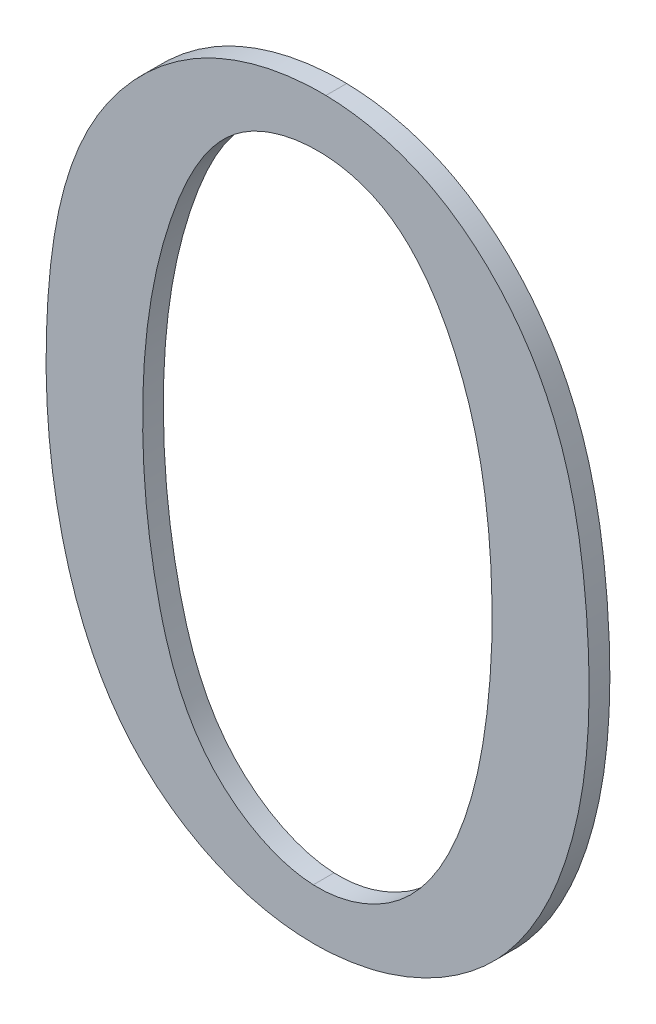
ISO-10303-21;
HEADER;
FILE_DESCRIPTION(('STEP AP214'),'2;1');
FILE_NAME('part.step','',(''),(''),'','','');
FILE_SCHEMA(('AUTOMOTIVE_DESIGN { 1 0 10303 214 1 1 1 1 }'));
ENDSEC;
DATA;
#1=APPLICATION_CONTEXT('core data for automotive mechanical design processes');
#2=APPLICATION_PROTOCOL_DEFINITION('international standard','automotive_design',2000,#1);
#3=PRODUCT_CONTEXT('',#1,'mechanical');
#4=PRODUCT('Part','Part','',(#3));
#5=PRODUCT_RELATED_PRODUCT_CATEGORY('part','',(#4));
#6=PRODUCT_DEFINITION_FORMATION('','',#4);
#7=PRODUCT_DEFINITION_CONTEXT('part definition',#1,'design');
#8=PRODUCT_DEFINITION('design','',#6,#7);
#9=PRODUCT_DEFINITION_SHAPE('','',#8);
#10=(LENGTH_UNIT() NAMED_UNIT(*) SI_UNIT(.MILLI.,.METRE.));
#11=(NAMED_UNIT(*) PLANE_ANGLE_UNIT() SI_UNIT($,.RADIAN.));
#12=(NAMED_UNIT(*) SI_UNIT($,.STERADIAN.) SOLID_ANGLE_UNIT());
#13=UNCERTAINTY_MEASURE_WITH_UNIT(LENGTH_MEASURE(1.E-05),#10,'distance_accuracy_value','');
#14=(GEOMETRIC_REPRESENTATION_CONTEXT(3) GLOBAL_UNCERTAINTY_ASSIGNED_CONTEXT((#13)) GLOBAL_UNIT_ASSIGNED_CONTEXT((#10,
#11,#12)) REPRESENTATION_CONTEXT('',''));
#15=CARTESIAN_POINT('',(0.,0.,0.));
#16=DIRECTION('',(0.,0.,1.));
#17=DIRECTION('',(1.,0.,0.));
#18=AXIS2_PLACEMENT_3D('',#15,#16,#17);
#19=CARTESIAN_POINT('',(0.,0.,0.05));
#20=DIRECTION('',(0.,0.,1.));
#21=DIRECTION('',(1.,0.,0.));
#22=AXIS2_PLACEMENT_3D('',#19,#20,#21);
#23=PLANE('',#22);
#24=CARTESIAN_POINT('',(-0.993622049562989,-2.83354620100467,0.05));
#25=CARTESIAN_POINT('',(-1.01621349821605,-2.83283314246044,0.05));
#26=CARTESIAN_POINT('',(-1.03891668393038,-2.83424035118711,0.05));
#27=CARTESIAN_POINT('',(-1.08373108073225,-2.84142533305858,0.05));
#28=CARTESIAN_POINT('',(-1.10583868348876,-2.84722535287117,0.05));
#29=CARTESIAN_POINT('',(-1.14543425474012,-2.8622141019412,0.05));
#30=CARTESIAN_POINT('',(-1.16313685193765,-2.87081856421989,0.05));
#31=CARTESIAN_POINT('',(-1.18799205663139,-2.8863198148663,0.05));
#32=CARTESIAN_POINT('',(-1.19597663243572,-2.89190261826089,0.05));
#33=CARTESIAN_POINT('',(-1.21133578068215,-2.90385466635892,0.05));
#34=CARTESIAN_POINT('',(-1.21871012842404,-2.91022419862132,0.05));
#35=CARTESIAN_POINT('',(-1.24149665690474,-2.93182671242595,0.05));
#36=CARTESIAN_POINT('',(-1.25568643253836,-2.94835737870916,0.05));
#37=CARTESIAN_POINT('',(-1.28138904175354,-2.98347429244935,0.05));
#38=CARTESIAN_POINT('',(-1.29288193188875,-3.00207444140932,0.05));
#39=CARTESIAN_POINT('',(-1.31432411942431,-3.04155236970739,0.05));
#40=CARTESIAN_POINT('',(-1.3241419752747,-3.06249979218505,0.05));
#41=CARTESIAN_POINT('',(-1.34206775927301,-3.10512702677778,0.05));
#42=CARTESIAN_POINT('',(-1.3501730385335,-3.12680791414391,0.05));
#43=CARTESIAN_POINT('',(-1.36514997514574,-3.1706017616821,0.05));
#44=CARTESIAN_POINT('',(-1.3720209633782,-3.19271494904868,0.05));
#45=CARTESIAN_POINT('',(-1.38447037947149,-3.23727939687559,0.05));
#46=CARTESIAN_POINT('',(-1.39004998969979,-3.25973032787985,0.05));
#47=CARTESIAN_POINT('',(-1.40399590066922,-3.32324864114575,0.05));
#48=CARTESIAN_POINT('',(-1.41094688332614,-3.36463188978735,0.05));
#49=CARTESIAN_POINT('',(-1.42114773707585,-3.44789191204677,0.05));
#50=CARTESIAN_POINT('',(-1.42439238818732,-3.48976929800393,0.05));
#51=CARTESIAN_POINT('',(-1.42687951665125,-3.55264519832025,0.05));
#52=CARTESIAN_POINT('',(-1.42731218911848,-3.57360627258616,0.05));
#53=CARTESIAN_POINT('',(-1.42747385179158,-3.61553134591197,0.05));
#54=CARTESIAN_POINT('',(-1.42720281158748,-3.63649534505911,0.05));
#55=CARTESIAN_POINT('',(-1.42531254100426,-3.69932091085984,0.05));
#56=CARTESIAN_POINT('',(-1.42261784871447,-3.74115996255967,0.05));
#57=CARTESIAN_POINT('',(-1.41620694186505,-3.80351403640446,0.05));
#58=CARTESIAN_POINT('',(-1.41368832211816,-3.82415832205073,0.05));
#59=CARTESIAN_POINT('',(-1.40783680155164,-3.86533511221441,0.05));
#60=CARTESIAN_POINT('',(-1.4045038040934,-3.88586760316981,0.05));
#61=CARTESIAN_POINT('',(-1.39700800695053,-3.92680134546588,0.05));
#62=CARTESIAN_POINT('',(-1.39284440980923,-3.94720245108119,0.05));
#63=CARTESIAN_POINT('',(-1.38362429811457,-3.98779915382978,0.05));
#64=CARTESIAN_POINT('',(-1.37856794818727,-4.0079947881276,0.05));
#65=CARTESIAN_POINT('',(-1.36443191021927,-4.05744698805098,0.05));
#66=CARTESIAN_POINT('',(-1.35457855766577,-4.08649613618047,0.05));
#67=CARTESIAN_POINT('',(-1.33069083702329,-4.14274826068706,0.05));
#68=CARTESIAN_POINT('',(-1.31667921879037,-4.16996031820831,0.05));
#69=CARTESIAN_POINT('',(-1.28745581030387,-4.21483707444749,0.05));
#70=CARTESIAN_POINT('',(-1.27335921116791,-4.23321668703175,0.05));
#71=CARTESIAN_POINT('',(-1.24215967661568,-4.26734011271521,0.05));
#72=CARTESIAN_POINT('',(-1.2250470003049,-4.28307505260181,0.05));
#73=CARTESIAN_POINT('',(-1.18836031984282,-4.31152586204723,0.05));
#74=CARTESIAN_POINT('',(-1.16877601753389,-4.32422841659115,0.05));
#75=CARTESIAN_POINT('',(-1.127644715583,-4.34578023458505,0.05));
#76=CARTESIAN_POINT('',(-1.10610761304161,-4.35464774441303,0.05));
#77=CARTESIAN_POINT('',(-1.07279578589066,-4.36431214701863,0.05));
#78=CARTESIAN_POINT('',(-1.06153793853756,-4.36692652742064,0.05));
#79=CARTESIAN_POINT('',(-1.03876600956441,-4.37081105458462,0.05));
#80=CARTESIAN_POINT('',(-1.02725135515949,-4.37207780702638,0.05));
#81=CARTESIAN_POINT('',(-1.01568012379935,-4.37259357253366,0.05));
#82=B_SPLINE_CURVE_WITH_KNOTS('',3,(#24,#25,#26,#27,#28,#29,#30,#31,#32,#33,#34,#35,#36,#37,#38,
#39,#40,#41,#42,#43,#44,#45,#46,#47,#48,#49,#50,#51,#52,#53,#54,#55,#56,#57,#58,#59,#60,#61,#62,
#63,#64,#65,#66,#67,#68,#69,#70,#71,#72,#73,#74,#75,#76,#77,#78,#79,#80,#81),.UNSPECIFIED.,.F.,
.F.,(4,2,2,2,2,2,2,2,2,2,2,2,2,2,2,2,2,2,2,2,2,2,2,2,2,2,2,2,4),(0.,0.0677799652700998,
0.135905505527599,0.194545605237095,0.223724035601037,0.252913162772909,0.3178665943049,
0.383286199488275,0.452573742867857,0.521967683055773,0.591399129483015,0.660766751731908,
0.786452350423463,0.912314746757769,0.975200846877584,1.03808966458041,1.16373569822066,
1.22611488887498,1.28850148539192,1.3509482699193,1.41338355109159,1.50519383502833,
1.59651080513591,1.66568136946222,1.73507956741071,1.80477710318597,1.87413928293902,
1.90873930894442,1.94342627846349),.UNSPECIFIED.);
#83=CARTESIAN_POINT('',(-0.993622049562989,-2.83354620100466,0.05));
#84=VERTEX_POINT('',#83);
#85=CARTESIAN_POINT('',(-1.0156801237992,-4.37259357253339,0.05));
#86=VERTEX_POINT('',#85);
#87=EDGE_CURVE('E105',#84,#86,#82,.T.);
#88=ORIENTED_EDGE('',*,*,#87,.F.);
#89=CARTESIAN_POINT('',(-1.01568012379919,-4.37259357253312,0.05));
#90=CARTESIAN_POINT('',(-0.998977398715831,-4.37334668369637,0.05));
#91=CARTESIAN_POINT('',(-0.982262975398597,-4.37247907838417,0.05));
#92=CARTESIAN_POINT('',(-0.949268128925352,-4.36787422922595,0.05));
#93=CARTESIAN_POINT('',(-0.932986719265759,-4.36414421388707,0.05));
#94=CARTESIAN_POINT('',(-0.901299307044916,-4.35420909322109,0.05));
#95=CARTESIAN_POINT('',(-0.885889657703982,-4.34801532933845,0.05));
#96=CARTESIAN_POINT('',(-0.85614558106627,-4.33343231473239,0.05));
#97=CARTESIAN_POINT('',(-0.841811236667662,-4.32504289496325,0.05));
#98=CARTESIAN_POINT('',(-0.812920732830148,-4.30508197253257,0.05));
#99=CARTESIAN_POINT('',(-0.798544452524687,-4.29324939766546,0.05));
#100=CARTESIAN_POINT('',(-0.771759581617321,-4.26754861438779,0.05));
#101=CARTESIAN_POINT('',(-0.75935294300782,-4.25367841248971,0.05));
#102=CARTESIAN_POINT('',(-0.728840439875247,-4.21489995242396,0.05));
#103=CARTESIAN_POINT('',(-0.712347298580316,-4.188727971387,0.05));
#104=CARTESIAN_POINT('',(-0.690651027950262,-4.14792155114691,0.05));
#105=CARTESIAN_POINT('',(-0.683916613827432,-4.1340343668766,0.05));
#106=CARTESIAN_POINT('',(-0.671308750489108,-4.10587248728212,0.05));
#107=CARTESIAN_POINT('',(-0.665435157692496,-4.09159785705401,0.05));
#108=CARTESIAN_POINT('',(-0.649518753330763,-4.04980692169234,0.05));
#109=CARTESIAN_POINT('',(-0.640468638156906,-4.02191103417305,0.05));
#110=CARTESIAN_POINT('',(-0.624834565518525,-3.96542948029411,0.05));
#111=CARTESIAN_POINT('',(-0.618252626773926,-3.9368432695693,0.05));
#112=CARTESIAN_POINT('',(-0.607078494523846,-3.87914200562613,0.05));
#113=CARTESIAN_POINT('',(-0.602496858640348,-3.85002497169625,0.05));
#114=CARTESIAN_POINT('',(-0.59486700382088,-3.79160505468036,0.05));
#115=CARTESIAN_POINT('',(-0.59181841922562,-3.76230221760171,0.05));
#116=CARTESIAN_POINT('',(-0.585836604874688,-3.68592857066684,0.05));
#117=CARTESIAN_POINT('',(-0.584073217141164,-3.63876047733424,0.05));
#118=CARTESIAN_POINT('',(-0.58428770201693,-3.54438827803026,0.05));
#119=CARTESIAN_POINT('',(-0.586270136703927,-3.4971841982254,0.05));
#120=CARTESIAN_POINT('',(-0.59388778926284,-3.40348174463469,0.05));
#121=CARTESIAN_POINT('',(-0.599489722447314,-3.3569808529613,0.05));
#122=CARTESIAN_POINT('',(-0.616133482709873,-3.26495754389704,0.05));
#123=CARTESIAN_POINT('',(-0.627163741750178,-3.21943325966363,0.05));
#124=CARTESIAN_POINT('',(-0.649547671204908,-3.15069532536715,0.05));
#125=CARTESIAN_POINT('',(-0.658504112619677,-3.12669352601481,0.05));
#126=CARTESIAN_POINT('',(-0.678515219736413,-3.07958661909986,0.05));
#127=CARTESIAN_POINT('',(-0.689568500596591,-3.05648093176968,0.05));
#128=CARTESIAN_POINT('',(-0.714393170727437,-3.0113630450389,0.05));
#129=CARTESIAN_POINT('',(-0.728196964726775,-2.98936823101312,0.05));
#130=CARTESIAN_POINT('',(-0.759201943643932,-2.9479632965516,0.05));
#131=CARTESIAN_POINT('',(-0.776384735196493,-2.92854009544258,0.05));
#132=CARTESIAN_POINT('',(-0.808156404630453,-2.89993605960512,0.05));
#133=CARTESIAN_POINT('',(-0.821619960055952,-2.88952504010305,0.05));
#134=CARTESIAN_POINT('',(-0.850226756079179,-2.87131532060287,0.05));
#135=CARTESIAN_POINT('',(-0.865369688607754,-2.86351614253369,0.05));
#136=CARTESIAN_POINT('',(-0.8967245716678,-2.85066146791451,0.05));
#137=CARTESIAN_POINT('',(-0.91293468541031,-2.84560138860419,0.05));
#138=CARTESIAN_POINT('',(-0.945934585094399,-2.83804706207882,0.05));
#139=CARTESIAN_POINT('',(-0.962724225746551,-2.83555217652079,0.05));
#140=CARTESIAN_POINT('',(-0.984262466184287,-2.83395406485446,0.05));
#141=CARTESIAN_POINT('',(-0.988941676434133,-2.83370279384799,0.05));
#142=CARTESIAN_POINT('',(-0.993622049562988,-2.83354620100464,0.05));
#143=B_SPLINE_CURVE_WITH_KNOTS('',3,(#89,#90,#91,#92,#93,#94,#95,#96,#97,#98,#99,#100,#101,#102,
#103,#104,#105,#106,#107,#108,#109,#110,#111,#112,#113,#114,#115,#116,#117,#118,#119,#120,#121,
#122,#123,#124,#125,#126,#127,#128,#129,#130,#131,#132,#133,#134,#135,#136,#137,#138,#139,#140,
#141,#142),.UNSPECIFIED.,.F.,.F.,(4,2,2,2,2,2,2,2,2,2,2,2,2,2,2,2,2,2,2,2,2,2,2,2,2,2,4),(0.,
0.0499939568893522,0.0998620767203614,0.149503245638216,0.19914823760373,0.254751899174562,
0.310410326725583,0.402645795864626,0.448934072599764,0.4952146198506,0.583056303584182,
0.670969677078098,0.759341608362729,0.847692451401234,0.989127235021357,1.13073438463424,
1.27105750830802,1.41108288279973,1.48785051490157,1.56456762180822,1.64224857793351,
1.71951783716142,1.77033847261505,1.82114980077632,1.87187585214553,1.92258927738786,
1.93664257474663),.UNSPECIFIED.);
#144=EDGE_CURVE('E146',#86,#84,#143,.T.);
#145=ORIENTED_EDGE('',*,*,#144,.F.);
#146=EDGE_LOOP('',(#88,#145));
#147=FACE_BOUND('',#146,.T.);
#148=CARTESIAN_POINT('',(-1.01550550810966,-4.49508674440558,0.05));
#149=CARTESIAN_POINT('',(-0.99837899342769,-4.49514275357607,0.05));
#150=CARTESIAN_POINT('',(-0.981258548164407,-4.49446141749647,0.05));
#151=CARTESIAN_POINT('',(-0.947142339694509,-4.49163686055452,0.05));
#152=CARTESIAN_POINT('',(-0.930146550437761,-4.48949395446367,0.05));
#153=CARTESIAN_POINT('',(-0.879506356313942,-4.48089206866946,0.05));
#154=CARTESIAN_POINT('',(-0.846206517785656,-4.47225992604298,0.05));
#155=CARTESIAN_POINT('',(-0.781579122097005,-4.44959813424604,0.05));
#156=CARTESIAN_POINT('',(-0.750248948800369,-4.43557582847103,0.05));
#157=CARTESIAN_POINT('',(-0.690289672530589,-4.40268363493706,0.05));
#158=CARTESIAN_POINT('',(-0.661657754710261,-4.38381887714949,0.05));
#159=CARTESIAN_POINT('',(-0.607112908824592,-4.34096776690495,0.05));
#160=CARTESIAN_POINT('',(-0.581303708230917,-4.3168480217517,0.05));
#161=CARTESIAN_POINT('',(-0.534370902660908,-4.26441606313266,0.05));
#162=CARTESIAN_POINT('',(-0.513251583879393,-4.23610005367884,0.05));
#163=CARTESIAN_POINT('',(-0.469206935806305,-4.16680274049215,0.05));
#164=CARTESIAN_POINT('',(-0.448006726707776,-4.12473608682205,0.05));
#165=CARTESIAN_POINT('',(-0.421351862031746,-4.05962342448411,0.05));
#166=CARTESIAN_POINT('',(-0.413318434812916,-4.03755814850853,0.05));
#167=CARTESIAN_POINT('',(-0.398817961023092,-3.99291242831324,0.05));
#168=CARTESIAN_POINT('',(-0.392350953782008,-3.97033197117386,0.05));
#169=CARTESIAN_POINT('',(-0.377893375871974,-3.91284532319142,0.05));
#170=CARTESIAN_POINT('',(-0.370885077879054,-3.87769115737071,0.05));
#171=CARTESIAN_POINT('',(-0.360020840654708,-3.80690251912315,0.05));
#172=CARTESIAN_POINT('',(-0.356166008585009,-3.77126788246565,0.05));
#173=CARTESIAN_POINT('',(-0.351175817981176,-3.69964101479832,0.05));
#174=CARTESIAN_POINT('',(-0.350054132487849,-3.66364788669403,0.05));
#175=CARTESIAN_POINT('',(-0.350117205076619,-3.59166585280207,0.05));
#176=CARTESIAN_POINT('',(-0.35130238290878,-3.55567694897466,0.05));
#177=CARTESIAN_POINT('',(-0.354372093579797,-3.50328628554547,0.05));
#178=CARTESIAN_POINT('',(-0.355529788911434,-3.48683686285715,0.05));
#179=CARTESIAN_POINT('',(-0.358209173065266,-3.45396783936059,0.05));
#180=CARTESIAN_POINT('',(-0.359730856392877,-3.43754823810596,0.05));
#181=CARTESIAN_POINT('',(-0.364967985521243,-3.38835423956911,0.05));
#182=CARTESIAN_POINT('',(-0.369355463452381,-3.35564555968316,0.05));
#183=CARTESIAN_POINT('',(-0.380505436850438,-3.29085679105527,0.05));
#184=CARTESIAN_POINT('',(-0.38725091078145,-3.25877389237495,0.05));
#185=CARTESIAN_POINT('',(-0.403753543962052,-3.19540817863297,0.05));
#186=CARTESIAN_POINT('',(-0.413507607860197,-3.16412457688034,0.05));
#187=CARTESIAN_POINT('',(-0.438766257424035,-3.09728720780177,0.05));
#188=CARTESIAN_POINT('',(-0.454995628598031,-3.06199668409931,0.05));
#189=CARTESIAN_POINT('',(-0.493098708665102,-2.99449389070704,0.05));
#190=CARTESIAN_POINT('',(-0.514982688675055,-2.9622873702985,0.05));
#191=CARTESIAN_POINT('',(-0.563943167077291,-2.90180337965092,0.05));
#192=CARTESIAN_POINT('',(-0.591046869602773,-2.87354789522254,0.05));
#193=CARTESIAN_POINT('',(-0.649990964994206,-2.82249180328482,0.05));
#194=CARTESIAN_POINT('',(-0.681822414425003,-2.79968110386323,0.05));
#195=CARTESIAN_POINT('',(-0.746450439750207,-2.76312881204835,0.05));
#196=CARTESIAN_POINT('',(-0.778879544758867,-2.74873940298932,0.05));
#197=CARTESIAN_POINT('',(-0.845856112605676,-2.72635319097054,0.05));
#198=CARTESIAN_POINT('',(-0.880402224910848,-2.71835235723902,0.05));
#199=CARTESIAN_POINT('',(-0.926920720924731,-2.71191472649269,0.05));
#200=CARTESIAN_POINT('',(-0.938557599864757,-2.71065929079347,0.05));
#201=CARTESIAN_POINT('',(-0.961853178092834,-2.70884191047768,0.05));
#202=CARTESIAN_POINT('',(-0.973511728573983,-2.70827806188659,0.05));
#203=CARTESIAN_POINT('',(-0.9851826863659,-2.708054097028,0.05));
#204=B_SPLINE_CURVE_WITH_KNOTS('',3,(#148,#149,#150,#151,#152,#153,#154,#155,#156,#157,#158,
#159,#160,#161,#162,#163,#164,#165,#166,#167,#168,#169,#170,#171,#172,#173,#174,#175,#176,#177,
#178,#179,#180,#181,#182,#183,#184,#185,#186,#187,#188,#189,#190,#191,#192,#193,#194,#195,#196,
#197,#198,#199,#200,#201,#202,#203),.UNSPECIFIED.,.F.,.F.,(4,2,2,2,2,2,2,2,2,2,2,2,2,2,2,2,2,2,
2,2,2,2,2,2,2,2,2,4),(0.,0.0513473515449543,0.10268364814148,0.205348522397188,
0.307874022023171,0.410291353773996,0.5156974113686,0.621199409193594,0.761700941753019,
0.832108148232498,0.902517122323538,1.00988645744719,1.11729347309886,1.22523671778053,
1.33319960533352,1.38266704203714,1.43213373205176,1.53106984918317,1.62930604732336,
1.72744151157158,1.8434950607409,1.95976091163106,2.07664996982239,2.19332066182609,
2.29910031366481,2.4048131726326,2.43991230291878,2.47491458503729),.UNSPECIFIED.);
#205=CARTESIAN_POINT('',(-1.01550550810966,-4.49508674440565,0.05));
#206=VERTEX_POINT('',#205);
#207=CARTESIAN_POINT('',(-0.985182686365902,-2.7080540970281,0.05));
#208=VERTEX_POINT('',#207);
#209=EDGE_CURVE('E63',#206,#208,#204,.T.);
#210=ORIENTED_EDGE('',*,*,#209,.T.);
#211=CARTESIAN_POINT('',(-0.985182686365904,-2.7080540970282,0.05));
#212=CARTESIAN_POINT('',(-1.0195054785009,-2.7074212204339,0.05));
#213=CARTESIAN_POINT('',(-1.05386170657166,-2.70968719248375,0.05));
#214=CARTESIAN_POINT('',(-1.1216795584063,-2.71985530664894,0.05));
#215=CARTESIAN_POINT('',(-1.15514239861968,-2.72774933180749,0.05));
#216=CARTESIAN_POINT('',(-1.22038496234083,-2.74903358360591,0.05));
#217=CARTESIAN_POINT('',(-1.25216097678,-2.76243539817251,0.05));
#218=CARTESIAN_POINT('',(-1.29764142804317,-2.78657723994159,0.05));
#219=CARTESIAN_POINT('',(-1.31244133135335,-2.79530059300349,0.05));
#220=CARTESIAN_POINT('',(-1.34122610626415,-2.81400373995116,0.05));
#221=CARTESIAN_POINT('',(-1.35521086562436,-2.82398370626996,0.05));
#222=CARTESIAN_POINT('',(-1.39514130968766,-2.85500836853745,0.05));
#223=CARTESIAN_POINT('',(-1.4199017605431,-2.87759710704193,0.05));
#224=CARTESIAN_POINT('',(-1.46589244252199,-2.92611552562047,0.05));
#225=CARTESIAN_POINT('',(-1.48712085866431,-2.95204691128487,0.05));
#226=CARTESIAN_POINT('',(-1.51744676542104,-2.9949118548085,0.05));
#227=CARTESIAN_POINT('',(-1.5278445305897,-3.01093959683713,0.05));
#228=CARTESIAN_POINT('',(-1.54728528109042,-3.04379693501194,0.05));
#229=CARTESIAN_POINT('',(-1.556328271992,-3.06062652786132,0.05));
#230=CARTESIAN_POINT('',(-1.58138816872963,-3.11208626326093,0.05));
#231=CARTESIAN_POINT('',(-1.59536282128603,-3.14772561982821,0.05));
#232=CARTESIAN_POINT('',(-1.61651484255669,-3.214410884685,0.05));
#233=CARTESIAN_POINT('',(-1.62443649775287,-3.24523377694702,0.05));
#234=CARTESIAN_POINT('',(-1.63749656854595,-3.30748487181322,0.05));
#235=CARTESIAN_POINT('',(-1.64263218126262,-3.33891365118045,0.05));
#236=CARTESIAN_POINT('',(-1.65072105589884,-3.40221971002247,0.05));
#237=CARTESIAN_POINT('',(-1.65366132915376,-3.43409853930096,0.05));
#238=CARTESIAN_POINT('',(-1.65800490467578,-3.49794641357791,0.05));
#239=CARTESIAN_POINT('',(-1.65940857612639,-3.5299154350554,0.05));
#240=CARTESIAN_POINT('',(-1.66073009554466,-3.59905991696326,0.05));
#241=CARTESIAN_POINT('',(-1.66037117189994,-3.63624186441361,0.05));
#242=CARTESIAN_POINT('',(-1.65712644673813,-3.71050624506079,0.05));
#243=CARTESIAN_POINT('',(-1.6542404482625,-3.74758867027496,0.05));
#244=CARTESIAN_POINT('',(-1.64570040469219,-3.82126893140597,0.05));
#245=CARTESIAN_POINT('',(-1.64005877510254,-3.85786819165581,0.05));
#246=CARTESIAN_POINT('',(-1.62587651001136,-3.93049386308143,0.05));
#247=CARTESIAN_POINT('',(-1.61733732599094,-3.96652055163677,0.05));
#248=CARTESIAN_POINT('',(-1.59622614212801,-4.03917773933332,0.05));
#249=CARTESIAN_POINT('',(-1.58348895740571,-4.07576164353837,0.05));
#250=CARTESIAN_POINT('',(-1.55316705021058,-4.14688905719526,0.05));
#251=CARTESIAN_POINT('',(-1.53559022445831,-4.18143578011759,0.05));
#252=CARTESIAN_POINT('',(-1.50481087084597,-4.23086542562008,0.05));
#253=CARTESIAN_POINT('',(-1.49370899021734,-4.2470625434523,0.05));
#254=CARTESIAN_POINT('',(-1.46997966235191,-4.27829279554428,0.05));
#255=CARTESIAN_POINT('',(-1.45735271601088,-4.29332630933308,0.05));
#256=CARTESIAN_POINT('',(-1.41719552977907,-4.33631296688514,0.05));
#257=CARTESIAN_POINT('',(-1.38737254026027,-4.36217941486089,0.05));
#258=CARTESIAN_POINT('',(-1.3281423781895,-4.40422796914432,0.05));
#259=CARTESIAN_POINT('',(-1.29933461134968,-4.42127860900421,0.05));
#260=CARTESIAN_POINT('',(-1.23931160606199,-4.45045551078412,0.05));
#261=CARTESIAN_POINT('',(-1.20809760299187,-4.4625842798517,0.05));
#262=CARTESIAN_POINT('',(-1.15006791573668,-4.47953480901039,0.05));
#263=CARTESIAN_POINT('',(-1.1235273791172,-4.48530115921312,0.05));
#264=CARTESIAN_POINT('',(-1.08328148742578,-4.49109705500292,0.05));
#265=CARTESIAN_POINT('',(-1.06976937762697,-4.49255344965934,0.05));
#266=CARTESIAN_POINT('',(-1.04267461533505,-4.49452325173471,0.05));
#267=CARTESIAN_POINT('',(-1.02909195407206,-4.49503653896436,0.05));
#268=CARTESIAN_POINT('',(-1.0155055081105,-4.49508674440572,0.05));
#269=B_SPLINE_CURVE_WITH_KNOTS('',3,(#211,#212,#213,#214,#215,#216,#217,#218,#219,#220,#221,
#222,#223,#224,#225,#226,#227,#228,#229,#230,#231,#232,#233,#234,#235,#236,#237,#238,#239,#240,
#241,#242,#243,#244,#245,#246,#247,#248,#249,#250,#251,#252,#253,#254,#255,#256,#257,#258,#259,
#260,#261,#262,#263,#264,#265,#266,#267,#268),.UNSPECIFIED.,.F.,.F.,(4,2,2,2,2,2,2,2,2,2,2,2,2,
2,2,2,2,2,2,2,2,2,2,2,2,2,2,2,4),(0.,0.102832228046393,0.205516447424163,0.308417820849787,
0.359896166186398,0.411381583118591,0.511519183970249,0.611708083939148,0.6689655480373,
0.726222776741873,0.840598752124719,0.935933926421453,1.03136483502932,1.12735597873606,
1.22332405457297,1.33480088196877,1.44628639856792,1.55727418656665,1.66820645897713,
1.78416469504081,1.89993483488504,1.95876322668253,2.01757234903673,2.13509721906231,
2.23512112145908,2.33509400861445,2.41628830111646,2.45702989367145,2.49777667796136),.UNSPECIFIED.);
#270=EDGE_CURVE('E21',#208,#206,#269,.T.);
#271=ORIENTED_EDGE('',*,*,#270,.T.);
#272=EDGE_LOOP('',(#210,#271));
#273=FACE_BOUND('',#272,.T.);
#274=ADVANCED_FACE('F17',(#147,#273),#23,.T.);
#275=CARTESIAN_POINT('',(-0.9660261901948,-4.493197661786,0.));
#276=CARTESIAN_POINT('',(-0.9824873113382,-4.49451142927,0.));
#277=CARTESIAN_POINT('',(-1.041825594561,-4.496785392098,0.));
#278=CARTESIAN_POINT('',(-1.218876023884,-4.476963311409,0.));
#279=CARTESIAN_POINT('',(-1.504832758588,-4.311414437942,0.));
#280=CARTESIAN_POINT('',(-1.65264745995,-3.91154883447,0.));
#281=CARTESIAN_POINT('',(-1.671567515468,-3.472294432032,0.));
#282=CARTESIAN_POINT('',(-1.603935768815,-3.063441610539,0.));
#283=CARTESIAN_POINT('',(-1.32258026761,-2.762061522558,0.));
#284=CARTESIAN_POINT('',(-1.076589463482,-2.701757014729,0.));
#285=CARTESIAN_POINT('',(-0.9518108090655,-2.709393143546,0.));
#286=CARTESIAN_POINT('',(-0.9352843952359,-2.711105636117,0.));
#287=(BOUNDED_CURVE() B_SPLINE_CURVE(3,(#275,#276,#277,#278,#279,#280,#281,#282,#283,#284,#285,
#286),.UNSPECIFIED.,.F.,.F.) B_SPLINE_CURVE_WITH_KNOTS((4,1,1,1,1,1,1,1,1,4),(0.,
0.01923076923077,0.06911593421038,0.2063272369226,0.3814394530443,0.5416169619738,
0.725033855755,0.8558708741521,0.9807692307692,1.),
.UNSPECIFIED.) CURVE() GEOMETRIC_REPRESENTATION_ITEM() RATIONAL_B_SPLINE_CURVE((1.,1.,1.,1.,1.,
1.,1.,1.,1.,1.,1.,1.)) REPRESENTATION_ITEM(''));
#288=DIRECTION('',(0.,0.,1.));
#289=VECTOR('',#288,1.);
#290=SURFACE_OF_LINEAR_EXTRUSION('',#287,#289);
#291=ORIENTED_EDGE('',*,*,#270,.F.);
#292=DIRECTION('',(0.,0.,1.));
#293=VECTOR('',#292,1.);
#294=CARTESIAN_POINT('',(-0.9851826863659,-2.708054097028,0.));
#295=LINE('',#294,#293);
#296=CARTESIAN_POINT('',(-0.985182686365902,-2.7080540970281,0.));
#297=VERTEX_POINT('',#296);
#298=EDGE_CURVE('E69',#208,#297,#295,.F.);
#299=ORIENTED_EDGE('',*,*,#298,.T.);
#300=CARTESIAN_POINT('',(-0.985182686365904,-2.7080540970282,0.));
#301=CARTESIAN_POINT('',(-1.0195054785009,-2.7074212204339,0.));
#302=CARTESIAN_POINT('',(-1.05386170657166,-2.70968719248375,0.));
#303=CARTESIAN_POINT('',(-1.1216795584063,-2.71985530664894,0.));
#304=CARTESIAN_POINT('',(-1.15514239861968,-2.72774933180749,0.));
#305=CARTESIAN_POINT('',(-1.22038496234083,-2.74903358360591,0.));
#306=CARTESIAN_POINT('',(-1.25216097678,-2.76243539817251,0.));
#307=CARTESIAN_POINT('',(-1.29764142804317,-2.78657723994159,0.));
#308=CARTESIAN_POINT('',(-1.31244133135335,-2.79530059300349,0.));
#309=CARTESIAN_POINT('',(-1.34122610626415,-2.81400373995116,0.));
#310=CARTESIAN_POINT('',(-1.35521086562436,-2.82398370626996,0.));
#311=CARTESIAN_POINT('',(-1.39514130968766,-2.85500836853745,0.));
#312=CARTESIAN_POINT('',(-1.4199017605431,-2.87759710704193,0.));
#313=CARTESIAN_POINT('',(-1.46589244252199,-2.92611552562047,0.));
#314=CARTESIAN_POINT('',(-1.48712085866431,-2.95204691128487,0.));
#315=CARTESIAN_POINT('',(-1.51744676542104,-2.9949118548085,0.));
#316=CARTESIAN_POINT('',(-1.5278445305897,-3.01093959683713,0.));
#317=CARTESIAN_POINT('',(-1.54728528109042,-3.04379693501194,0.));
#318=CARTESIAN_POINT('',(-1.556328271992,-3.06062652786132,0.));
#319=CARTESIAN_POINT('',(-1.58138816872963,-3.11208626326093,0.));
#320=CARTESIAN_POINT('',(-1.59536282128603,-3.14772561982821,0.));
#321=CARTESIAN_POINT('',(-1.61651484255669,-3.214410884685,0.));
#322=CARTESIAN_POINT('',(-1.62443649775287,-3.24523377694702,0.));
#323=CARTESIAN_POINT('',(-1.63749656854595,-3.30748487181322,0.));
#324=CARTESIAN_POINT('',(-1.64263218126262,-3.33891365118045,0.));
#325=CARTESIAN_POINT('',(-1.65072105589884,-3.40221971002247,0.));
#326=CARTESIAN_POINT('',(-1.65366132915376,-3.43409853930096,0.));
#327=CARTESIAN_POINT('',(-1.65800490467578,-3.49794641357791,0.));
#328=CARTESIAN_POINT('',(-1.65940857612639,-3.5299154350554,0.));
#329=CARTESIAN_POINT('',(-1.66073009554466,-3.59905991696326,0.));
#330=CARTESIAN_POINT('',(-1.66037117189994,-3.63624186441361,0.));
#331=CARTESIAN_POINT('',(-1.65712644673813,-3.71050624506079,0.));
#332=CARTESIAN_POINT('',(-1.6542404482625,-3.74758867027496,0.));
#333=CARTESIAN_POINT('',(-1.64570040469219,-3.82126893140597,0.));
#334=CARTESIAN_POINT('',(-1.64005877510254,-3.85786819165581,0.));
#335=CARTESIAN_POINT('',(-1.62587651001136,-3.93049386308143,0.));
#336=CARTESIAN_POINT('',(-1.61733732599094,-3.96652055163677,0.));
#337=CARTESIAN_POINT('',(-1.59622614212801,-4.03917773933332,0.));
#338=CARTESIAN_POINT('',(-1.58348895740571,-4.07576164353837,0.));
#339=CARTESIAN_POINT('',(-1.55316705021058,-4.14688905719526,0.));
#340=CARTESIAN_POINT('',(-1.53559022445831,-4.18143578011759,0.));
#341=CARTESIAN_POINT('',(-1.50481087084597,-4.23086542562008,0.));
#342=CARTESIAN_POINT('',(-1.49370899021734,-4.2470625434523,0.));
#343=CARTESIAN_POINT('',(-1.46997966235191,-4.27829279554428,0.));
#344=CARTESIAN_POINT('',(-1.45735271601088,-4.29332630933308,0.));
#345=CARTESIAN_POINT('',(-1.41719552977907,-4.33631296688514,0.));
#346=CARTESIAN_POINT('',(-1.38737254026027,-4.36217941486089,0.));
#347=CARTESIAN_POINT('',(-1.3281423781895,-4.40422796914432,0.));
#348=CARTESIAN_POINT('',(-1.29933461134968,-4.42127860900421,0.));
#349=CARTESIAN_POINT('',(-1.23931160606199,-4.45045551078412,0.));
#350=CARTESIAN_POINT('',(-1.20809760299187,-4.4625842798517,0.));
#351=CARTESIAN_POINT('',(-1.15006791573668,-4.47953480901039,0.));
#352=CARTESIAN_POINT('',(-1.1235273791172,-4.48530115921312,0.));
#353=CARTESIAN_POINT('',(-1.08328148742578,-4.49109705500292,0.));
#354=CARTESIAN_POINT('',(-1.06976937762697,-4.49255344965934,0.));
#355=CARTESIAN_POINT('',(-1.04267461533505,-4.49452325173471,0.));
#356=CARTESIAN_POINT('',(-1.02909195407206,-4.49503653896436,0.));
#357=CARTESIAN_POINT('',(-1.0155055081105,-4.49508674440572,0.));
#358=B_SPLINE_CURVE_WITH_KNOTS('',3,(#300,#301,#302,#303,#304,#305,#306,#307,#308,#309,#310,
#311,#312,#313,#314,#315,#316,#317,#318,#319,#320,#321,#322,#323,#324,#325,#326,#327,#328,#329,
#330,#331,#332,#333,#334,#335,#336,#337,#338,#339,#340,#341,#342,#343,#344,#345,#346,#347,#348,
#349,#350,#351,#352,#353,#354,#355,#356,#357),.UNSPECIFIED.,.F.,.F.,(4,2,2,2,2,2,2,2,2,2,2,2,2,
2,2,2,2,2,2,2,2,2,2,2,2,2,2,2,4),(0.,0.102832228046393,0.205516447424163,0.308417820849787,
0.359896166186398,0.411381583118591,0.511519183970249,0.611708083939148,0.6689655480373,
0.726222776741873,0.840598752124719,0.935933926421453,1.03136483502932,1.12735597873606,
1.22332405457297,1.33480088196877,1.44628639856792,1.55727418656665,1.66820645897713,
1.78416469504081,1.89993483488504,1.95876322668253,2.01757234903673,2.13509721906231,
2.23512112145908,2.33509400861445,2.41628830111646,2.45702989367145,2.49777667796136),.UNSPECIFIED.);
#359=CARTESIAN_POINT('',(-1.01550550810933,-4.49508674440558,0.));
#360=VERTEX_POINT('',#359);
#361=EDGE_CURVE('E72',#297,#360,#358,.T.);
#362=ORIENTED_EDGE('',*,*,#361,.T.);
#363=DIRECTION('',(0.,0.,1.));
#364=VECTOR('',#363,1.);
#365=CARTESIAN_POINT('',(-1.015505508109,-4.49508674440558,0.));
#366=LINE('',#365,#364);
#367=EDGE_CURVE('E64',#360,#206,#366,.T.);
#368=ORIENTED_EDGE('',*,*,#367,.T.);
#369=EDGE_LOOP('',(#291,#299,#362,#368));
#370=FACE_BOUND('',#369,.T.);
#371=ADVANCED_FACE('F71',(#370),#290,.F.);
#372=CARTESIAN_POINT('',(-1.035506015607,-2.709186029951,0.));
#373=CARTESIAN_POINT('',(-1.018702770868,-2.708112431609,0.));
#374=CARTESIAN_POINT('',(-0.9110048350428,-2.705685522417,0.));
#375=CARTESIAN_POINT('',(-0.6871191199122,-2.761942137521,0.));
#376=CARTESIAN_POINT('',(-0.4187857173744,-3.043344115377,0.));
#377=CARTESIAN_POINT('',(-0.3377377190486,-3.490764457253,0.));
#378=CARTESIAN_POINT('',(-0.3533393103367,-3.93952926122,0.));
#379=CARTESIAN_POINT('',(-0.5332349826258,-4.316490549162,0.));
#380=CARTESIAN_POINT('',(-0.7944799529232,-4.472907523701,0.));
#381=CARTESIAN_POINT('',(-0.9776084838024,-4.497493175856,0.));
#382=CARTESIAN_POINT('',(-1.048519128609,-4.494281866501,0.));
#383=CARTESIAN_POINT('',(-1.06497109721,-4.492835247903,0.));
#384=(BOUNDED_CURVE() B_SPLINE_CURVE(3,(#372,#373,#374,#375,#376,#377,#378,#379,#380,#381,#382,
#383),.UNSPECIFIED.,.F.,.F.) B_SPLINE_CURVE_WITH_KNOTS((4,1,1,1,1,1,1,1,1,4),(0.,
0.01923076923077,0.1233019321168,0.2637853221862,0.4474383929756,0.6419796699285,
0.7867637492626,0.9173819322868,0.9807692307692,1.),
.UNSPECIFIED.) CURVE() GEOMETRIC_REPRESENTATION_ITEM() RATIONAL_B_SPLINE_CURVE((1.,1.,1.,1.,1.,
1.,1.,1.,1.,1.,1.,1.)) REPRESENTATION_ITEM(''));
#385=DIRECTION('',(0.,0.,1.));
#386=VECTOR('',#385,1.);
#387=SURFACE_OF_LINEAR_EXTRUSION('',#384,#386);
#388=ORIENTED_EDGE('',*,*,#209,.F.);
#389=ORIENTED_EDGE('',*,*,#367,.F.);
#390=CARTESIAN_POINT('',(-1.01550550810966,-4.49508674440558,0.));
#391=CARTESIAN_POINT('',(-0.99837899342769,-4.49514275357607,0.));
#392=CARTESIAN_POINT('',(-0.981258548164407,-4.49446141749647,0.));
#393=CARTESIAN_POINT('',(-0.947142339694509,-4.49163686055452,0.));
#394=CARTESIAN_POINT('',(-0.930146550437761,-4.48949395446367,0.));
#395=CARTESIAN_POINT('',(-0.879506356313942,-4.48089206866946,0.));
#396=CARTESIAN_POINT('',(-0.846206517785656,-4.47225992604298,0.));
#397=CARTESIAN_POINT('',(-0.781579122097005,-4.44959813424604,0.));
#398=CARTESIAN_POINT('',(-0.750248948800369,-4.43557582847103,0.));
#399=CARTESIAN_POINT('',(-0.690289672530589,-4.40268363493706,0.));
#400=CARTESIAN_POINT('',(-0.661657754710261,-4.38381887714949,0.));
#401=CARTESIAN_POINT('',(-0.607112908824592,-4.34096776690495,0.));
#402=CARTESIAN_POINT('',(-0.581303708230917,-4.3168480217517,0.));
#403=CARTESIAN_POINT('',(-0.534370902660908,-4.26441606313266,0.));
#404=CARTESIAN_POINT('',(-0.513251583879393,-4.23610005367884,0.));
#405=CARTESIAN_POINT('',(-0.469206935806305,-4.16680274049215,0.));
#406=CARTESIAN_POINT('',(-0.448006726707776,-4.12473608682205,0.));
#407=CARTESIAN_POINT('',(-0.421351862031746,-4.05962342448411,0.));
#408=CARTESIAN_POINT('',(-0.413318434812916,-4.03755814850853,0.));
#409=CARTESIAN_POINT('',(-0.398817961023092,-3.99291242831324,0.));
#410=CARTESIAN_POINT('',(-0.392350953782008,-3.97033197117386,0.));
#411=CARTESIAN_POINT('',(-0.377893375871974,-3.91284532319142,0.));
#412=CARTESIAN_POINT('',(-0.370885077879054,-3.87769115737071,0.));
#413=CARTESIAN_POINT('',(-0.360020840654708,-3.80690251912315,0.));
#414=CARTESIAN_POINT('',(-0.356166008585009,-3.77126788246565,0.));
#415=CARTESIAN_POINT('',(-0.351175817981176,-3.69964101479832,0.));
#416=CARTESIAN_POINT('',(-0.350054132487849,-3.66364788669403,0.));
#417=CARTESIAN_POINT('',(-0.350117205076619,-3.59166585280207,0.));
#418=CARTESIAN_POINT('',(-0.35130238290878,-3.55567694897466,0.));
#419=CARTESIAN_POINT('',(-0.354372093579797,-3.50328628554547,0.));
#420=CARTESIAN_POINT('',(-0.355529788911434,-3.48683686285715,0.));
#421=CARTESIAN_POINT('',(-0.358209173065266,-3.45396783936059,0.));
#422=CARTESIAN_POINT('',(-0.359730856392877,-3.43754823810596,0.));
#423=CARTESIAN_POINT('',(-0.364967985521243,-3.38835423956911,0.));
#424=CARTESIAN_POINT('',(-0.369355463452381,-3.35564555968316,0.));
#425=CARTESIAN_POINT('',(-0.380505436850438,-3.29085679105527,0.));
#426=CARTESIAN_POINT('',(-0.38725091078145,-3.25877389237495,0.));
#427=CARTESIAN_POINT('',(-0.403753543962052,-3.19540817863297,0.));
#428=CARTESIAN_POINT('',(-0.413507607860197,-3.16412457688034,0.));
#429=CARTESIAN_POINT('',(-0.438766257424035,-3.09728720780177,0.));
#430=CARTESIAN_POINT('',(-0.454995628598031,-3.06199668409931,0.));
#431=CARTESIAN_POINT('',(-0.493098708665102,-2.99449389070704,0.));
#432=CARTESIAN_POINT('',(-0.514982688675055,-2.9622873702985,0.));
#433=CARTESIAN_POINT('',(-0.563943167077291,-2.90180337965092,0.));
#434=CARTESIAN_POINT('',(-0.591046869602773,-2.87354789522254,0.));
#435=CARTESIAN_POINT('',(-0.649990964994206,-2.82249180328482,0.));
#436=CARTESIAN_POINT('',(-0.681822414425003,-2.79968110386323,0.));
#437=CARTESIAN_POINT('',(-0.746450439750207,-2.76312881204835,0.));
#438=CARTESIAN_POINT('',(-0.778879544758867,-2.74873940298932,0.));
#439=CARTESIAN_POINT('',(-0.845856112605676,-2.72635319097054,0.));
#440=CARTESIAN_POINT('',(-0.880402224910848,-2.71835235723902,0.));
#441=CARTESIAN_POINT('',(-0.926920720924731,-2.71191472649269,0.));
#442=CARTESIAN_POINT('',(-0.938557599864757,-2.71065929079347,0.));
#443=CARTESIAN_POINT('',(-0.961853178092834,-2.70884191047768,0.));
#444=CARTESIAN_POINT('',(-0.973511728573983,-2.70827806188659,0.));
#445=CARTESIAN_POINT('',(-0.9851826863659,-2.708054097028,0.));
#446=B_SPLINE_CURVE_WITH_KNOTS('',3,(#390,#391,#392,#393,#394,#395,#396,#397,#398,#399,#400,
#401,#402,#403,#404,#405,#406,#407,#408,#409,#410,#411,#412,#413,#414,#415,#416,#417,#418,#419,
#420,#421,#422,#423,#424,#425,#426,#427,#428,#429,#430,#431,#432,#433,#434,#435,#436,#437,#438,
#439,#440,#441,#442,#443,#444,#445),.UNSPECIFIED.,.F.,.F.,(4,2,2,2,2,2,2,2,2,2,2,2,2,2,2,2,2,2,
2,2,2,2,2,2,2,2,2,4),(0.,0.0513473515449543,0.10268364814148,0.205348522397188,
0.307874022023171,0.410291353773996,0.5156974113686,0.621199409193594,0.761700941753019,
0.832108148232498,0.902517122323538,1.00988645744719,1.11729347309886,1.22523671778053,
1.33319960533352,1.38266704203714,1.43213373205176,1.53106984918317,1.62930604732336,
1.72744151157158,1.8434950607409,1.95976091163106,2.07664996982239,2.19332066182609,
2.29910031366481,2.4048131726326,2.43991230291878,2.47491458503729),.UNSPECIFIED.);
#447=EDGE_CURVE('E101',#360,#297,#446,.T.);
#448=ORIENTED_EDGE('',*,*,#447,.T.);
#449=ORIENTED_EDGE('',*,*,#298,.F.);
#450=EDGE_LOOP('',(#388,#389,#448,#449));
#451=FACE_BOUND('',#450,.T.);
#452=ADVANCED_FACE('F66',(#451),#387,.F.);
#453=CARTESIAN_POINT('',(-1.013006214076,-2.833435612979,0.));
#454=CARTESIAN_POINT('',(-1.006540633535,-2.833293757642,0.));
#455=CARTESIAN_POINT('',(-0.9484113720163,-2.83362166852,0.));
#456=CARTESIAN_POINT('',(-0.8002872285528,-2.872139513902,0.));
#457=CARTESIAN_POINT('',(-0.6402226665544,-3.112182974317,0.));
#458=CARTESIAN_POINT('',(-0.5774594579145,-3.446397702467,0.));
#459=CARTESIAN_POINT('',(-0.5845940232703,-3.791249120126,0.));
#460=CARTESIAN_POINT('',(-0.6489471171522,-4.090512969279,0.));
#461=CARTESIAN_POINT('',(-0.7823407455303,-4.315917379053,0.));
#462=CARTESIAN_POINT('',(-0.9435271376274,-4.374610508697,0.));
#463=CARTESIAN_POINT('',(-1.018916913417,-4.372560031729,0.));
#464=CARTESIAN_POINT('',(-1.028370710157,-4.371800322685,0.));
#465=CARTESIAN_POINT('',(-1.034693999358,-4.371074670828,0.));
#466=(BOUNDED_CURVE() B_SPLINE_CURVE(3,(#453,#454,#455,#456,#457,#458,#459,#460,#461,#462,#463,
#464,#465),.UNSPECIFIED.,.F.,.F.) B_SPLINE_CURVE_WITH_KNOTS((4,1,1,1,1,1,1,1,1,1,4),(0.,
0.009640770285165,0.08667065904187,0.2250388540676,0.4171753901776,0.6062639417537,
0.7478019968585,0.8856166780563,0.9856261103381,0.9903592297148,1.),
.UNSPECIFIED.) CURVE() GEOMETRIC_REPRESENTATION_ITEM() RATIONAL_B_SPLINE_CURVE((1.,1.,1.,1.,1.,
1.,1.,1.,1.,1.,1.,1.,1.)) REPRESENTATION_ITEM(''));
#467=DIRECTION('',(0.,0.,1.));
#468=VECTOR('',#467,1.);
#469=SURFACE_OF_LINEAR_EXTRUSION('',#466,#468);
#470=DIRECTION('',(0.,0.,1.));
#471=VECTOR('',#470,1.);
#472=CARTESIAN_POINT('',(-0.993622049562989,-2.83354620100467,0.));
#473=LINE('',#472,#471);
#474=CARTESIAN_POINT('',(-0.993622049562989,-2.83354620100466,0.));
#475=VERTEX_POINT('',#474);
#476=EDGE_CURVE('E134',#475,#84,#473,.T.);
#477=ORIENTED_EDGE('',*,*,#476,.F.);
#478=CARTESIAN_POINT('',(-0.993622049562988,-2.83354620100464,0.));
#479=CARTESIAN_POINT('',(-0.975669390668068,-2.83416381747296,0.));
#480=CARTESIAN_POINT('',(-0.957723448785676,-2.83614733263827,0.));
#481=CARTESIAN_POINT('',(-0.922423561422144,-2.84299754687835,0.));
#482=CARTESIAN_POINT('',(-0.905068835607332,-2.84786027640025,0.));
#483=CARTESIAN_POINT('',(-0.871354173449021,-2.8606680061997,0.));
#484=CARTESIAN_POINT('',(-0.855002478042835,-2.86863537844881,0.));
#485=CARTESIAN_POINT('',(-0.824211396028141,-2.88758465080153,0.));
#486=CARTESIAN_POINT('',(-0.809768797006718,-2.89856138885655,0.));
#487=CARTESIAN_POINT('',(-0.779101515906616,-2.92600097704084,0.));
#488=CARTESIAN_POINT('',(-0.763494102437966,-2.94314098213276,0.));
#489=CARTESIAN_POINT('',(-0.742169942362684,-2.97047456210907,0.));
#490=CARTESIAN_POINT('',(-0.735392894027062,-2.97988643973868,0.));
#491=CARTESIAN_POINT('',(-0.722469444212413,-2.99913920811327,0.));
#492=CARTESIAN_POINT('',(-0.716323167883983,-3.00898018344516,0.));
#493=CARTESIAN_POINT('',(-0.699430967487256,-3.03780855775089,0.));
#494=CARTESIAN_POINT('',(-0.689403634248436,-3.05721527427631,0.));
#495=CARTESIAN_POINT('',(-0.670930380371833,-3.09677633640732,0.));
#496=CARTESIAN_POINT('',(-0.662486104257578,-3.1169314337041,0.));
#497=CARTESIAN_POINT('',(-0.647106408044521,-3.15788390128178,0.));
#498=CARTESIAN_POINT('',(-0.640175936370787,-3.17868313147759,0.));
#499=CARTESIAN_POINT('',(-0.627771981923663,-3.2206945569687,0.));
#500=CARTESIAN_POINT('',(-0.622297798448526,-3.24190654836976,0.));
#501=CARTESIAN_POINT('',(-0.608428413504685,-3.3033895626514,0.));
#502=CARTESIAN_POINT('',(-0.601690240480411,-3.34403774980983,0.));
#503=CARTESIAN_POINT('',(-0.594195271898042,-3.40526098539079,0.));
#504=CARTESIAN_POINT('',(-0.592132655225504,-3.42570176391276,0.));
#505=CARTESIAN_POINT('',(-0.588710611659183,-3.46664290435693,0.));
#506=CARTESIAN_POINT('',(-0.587351146790803,-3.4871432630013,0.));
#507=CARTESIAN_POINT('',(-0.584318546222992,-3.54882330218614,0.));
#508=CARTESIAN_POINT('',(-0.583705676343026,-3.59005935358782,0.));
#509=CARTESIAN_POINT('',(-0.585358974013144,-3.67246456437112,0.));
#510=CARTESIAN_POINT('',(-0.587624350750196,-3.71363373901611,0.));
#511=CARTESIAN_POINT('',(-0.593531352484718,-3.77854201851017,0.));
#512=CARTESIAN_POINT('',(-0.596201810989228,-3.80237323907871,0.));
#513=CARTESIAN_POINT('',(-0.602569566403276,-3.84990242192683,0.));
#514=CARTESIAN_POINT('',(-0.606266889505191,-3.87360038079155,0.));
#515=CARTESIAN_POINT('',(-0.61496599141423,-3.92071269160908,0.));
#516=CARTESIAN_POINT('',(-0.619965189330928,-3.94412750983121,0.));
#517=CARTESIAN_POINT('',(-0.631517413928706,-3.99056789500853,0.));
#518=CARTESIAN_POINT('',(-0.638069798170447,-4.01359361869631,0.));
#519=CARTESIAN_POINT('',(-0.65046935875206,-4.05151932083903,0.));
#520=CARTESIAN_POINT('',(-0.655828227791251,-4.06657865389791,0.));
#521=CARTESIAN_POINT('',(-0.667363348790162,-4.09637959476205,0.));
#522=CARTESIAN_POINT('',(-0.673539808232759,-4.11112112080832,0.));
#523=CARTESIAN_POINT('',(-0.693481604100444,-4.1546818275219,0.));
#524=CARTESIAN_POINT('',(-0.708678734384477,-4.18289988108154,0.));
#525=CARTESIAN_POINT('',(-0.738144130599058,-4.22702618341095,0.));
#526=CARTESIAN_POINT('',(-0.750992038559964,-4.2438727538383,0.));
#527=CARTESIAN_POINT('',(-0.779188184669505,-4.27534316067545,0.));
#528=CARTESIAN_POINT('',(-0.794532550850733,-4.28997037244012,0.));
#529=CARTESIAN_POINT('',(-0.827872877023477,-4.31622835284885,0.));
#530=CARTESIAN_POINT('',(-0.845894067222291,-4.32782734506641,0.));
#531=CARTESIAN_POINT('',(-0.883807181997289,-4.34741197221033,0.));
#532=CARTESIAN_POINT('',(-0.903698606755096,-4.35539856924913,0.));
#533=CARTESIAN_POINT('',(-0.939020141109632,-4.36556268998648,0.));
#534=CARTESIAN_POINT('',(-0.954163842418852,-4.36873566238547,0.));
#535=CARTESIAN_POINT('',(-0.984767712131511,-4.37260114764556,0.));
#536=CARTESIAN_POINT('',(-1.00022807815088,-4.37329206100704,0.));
#537=CARTESIAN_POINT('',(-1.01568012379509,-4.3725935725333,0.));
#538=B_SPLINE_CURVE_WITH_KNOTS('',3,(#478,#479,#480,#481,#482,#483,#484,#485,#486,#487,#488,
#489,#490,#491,#492,#493,#494,#495,#496,#497,#498,#499,#500,#501,#502,#503,#504,#505,#506,#507,
#508,#509,#510,#511,#512,#513,#514,#515,#516,#517,#518,#519,#520,#521,#522,#523,#524,#525,#526,
#527,#528,#529,#530,#531,#532,#533,#534,#535,#536,#537),.UNSPECIFIED.,.F.,.F.,(4,2,2,2,2,2,2,2,
2,2,2,2,2,2,2,2,2,2,2,2,2,2,2,2,2,2,2,2,2,4),(0.,0.0538989020642606,0.107723666551283,
0.161943685127642,0.216071274307695,0.285216023819685,0.319993519960308,0.354777902969396,
0.420209451760737,0.485708600500578,0.551418755175069,0.617097235597256,0.740458317618954,
0.802086186309608,0.863710726362073,0.987329332001741,1.11091398013876,1.18283725848808,
1.25476237156288,1.326545968636,1.39829992574831,1.44622750855562,1.49416727752046,
1.58985079561734,1.65321240654423,1.71647666539155,1.78038028200737,1.84426686872532,
1.89049646005531,1.93675583752708),.UNSPECIFIED.);
#539=CARTESIAN_POINT('',(-1.01568012379912,-4.37259357253367,0.));
#540=VERTEX_POINT('',#539);
#541=EDGE_CURVE('E30',#475,#540,#538,.T.);
#542=ORIENTED_EDGE('',*,*,#541,.T.);
#543=DIRECTION('',(0.,0.,1.));
#544=VECTOR('',#543,1.);
#545=CARTESIAN_POINT('',(-1.01568012379903,-4.37259357253368,0.));
#546=LINE('',#545,#544);
#547=EDGE_CURVE('E38',#86,#540,#546,.F.);
#548=ORIENTED_EDGE('',*,*,#547,.F.);
#549=ORIENTED_EDGE('',*,*,#144,.T.);
#550=EDGE_LOOP('',(#477,#542,#548,#549));
#551=FACE_BOUND('',#550,.T.);
#552=ADVANCED_FACE('F124',(#551),#469,.T.);
#553=CARTESIAN_POINT('',(-0.9966127598553,-4.37275987003,0.));
#554=CARTESIAN_POINT('',(-0.9998494671622,-4.372847875997,0.));
#555=CARTESIAN_POINT('',(-1.006208495828,-4.372905679628,0.));
#556=CARTESIAN_POINT('',(-1.104831949754,-4.370223285117,0.));
#557=CARTESIAN_POINT('',(-1.302635244479,-4.256893986655,0.));
#558=CARTESIAN_POINT('',(-1.40544725446,-3.948428213753,0.));
#559=CARTESIAN_POINT('',(-1.442161823278,-3.566992644427,0.));
#560=CARTESIAN_POINT('',(-1.39705632839,-3.193570735556,0.));
#561=CARTESIAN_POINT('',(-1.236415237362,-2.875830798755,0.));
#562=CARTESIAN_POINT('',(-1.055352585315,-2.829574736498,0.));
#563=CARTESIAN_POINT('',(-0.9807302226863,-2.834157631039,0.));
#564=CARTESIAN_POINT('',(-0.9743170384413,-2.834732687498,0.));
#565=(BOUNDED_CURVE() B_SPLINE_CURVE(3,(#553,#554,#555,#556,#557,#558,#559,#560,#561,#562,#563,
#564),.UNSPECIFIED.,.F.,.F.) B_SPLINE_CURVE_WITH_KNOTS((4,1,1,1,1,1,1,1,1,4),(0.,
0.004907650908457,0.009640770285165,0.1496340606348,0.3115375625937,0.4888259512838,
0.7352876182291,0.888275817419,0.9903592297148,1.),
.UNSPECIFIED.) CURVE() GEOMETRIC_REPRESENTATION_ITEM() RATIONAL_B_SPLINE_CURVE((1.,1.,1.,1.,1.,
1.,1.,1.,1.,1.,1.,1.)) REPRESENTATION_ITEM(''));
#566=DIRECTION('',(0.,0.,1.));
#567=VECTOR('',#566,1.);
#568=SURFACE_OF_LINEAR_EXTRUSION('',#565,#567);
#569=ORIENTED_EDGE('',*,*,#547,.T.);
#570=CARTESIAN_POINT('',(-1.01568012379922,-4.37259357253367,0.));
#571=CARTESIAN_POINT('',(-1.03354889589944,-4.3717937924001,0.));
#572=CARTESIAN_POINT('',(-1.05124639930799,-4.36921423942309,0.));
#573=CARTESIAN_POINT('',(-1.08584690920922,-4.36104524250636,0.));
#574=CARTESIAN_POINT('',(-1.10275361574028,-4.35547175507139,0.));
#575=CARTESIAN_POINT('',(-1.13906839590706,-4.34036770802025,0.));
#576=CARTESIAN_POINT('',(-1.15822407209936,-4.33024120855099,0.));
#577=CARTESIAN_POINT('',(-1.19467945656272,-4.30700252090491,0.));
#578=CARTESIAN_POINT('',(-1.21197388266583,-4.29388214879418,0.));
#579=CARTESIAN_POINT('',(-1.24444109810635,-4.26495264137262,0.));
#580=CARTESIAN_POINT('',(-1.25959305507288,-4.24912003101449,0.));
#581=CARTESIAN_POINT('',(-1.28711491224689,-4.21528034437311,0.));
#582=CARTESIAN_POINT('',(-1.29949134831005,-4.19727853332257,0.));
#583=CARTESIAN_POINT('',(-1.32800901026413,-4.14905126289296,0.));
#584=CARTESIAN_POINT('',(-1.34225918348556,-4.11771986957676,0.));
#585=CARTESIAN_POINT('',(-1.36010219002461,-4.06941916657489,0.));
#586=CARTESIAN_POINT('',(-1.36547532274571,-4.05303414604561,0.));
#587=CARTESIAN_POINT('',(-1.37527068656502,-4.01997537087758,0.));
#588=CARTESIAN_POINT('',(-1.37969282135316,-4.00330158717962,0.));
#589=CARTESIAN_POINT('',(-1.38835894416258,-3.96765977927458,0.));
#590=CARTESIAN_POINT('',(-1.3925087942518,-3.94866959959576,0.));
#591=CARTESIAN_POINT('',(-1.40009687122491,-3.91054659145994,0.));
#592=CARTESIAN_POINT('',(-1.40353502515746,-3.89141374858751,0.));
#593=CARTESIAN_POINT('',(-1.41276741186761,-3.83382419436735,0.));
#594=CARTESIAN_POINT('',(-1.41747673078951,-3.79518835500978,0.));
#595=CARTESIAN_POINT('',(-1.42418800059851,-3.7177623409987,0.));
#596=CARTESIAN_POINT('',(-1.42619457827116,-3.67897254440054,0.));
#597=CARTESIAN_POINT('',(-1.42782333370251,-3.60135106153446,0.));
#598=CARTESIAN_POINT('',(-1.42744618009962,-3.56251939006783,0.));
#599=CARTESIAN_POINT('',(-1.42439110371242,-3.49401579355183,0.));
#600=CARTESIAN_POINT('',(-1.42227023753225,-3.46431959339591,0.));
#601=CARTESIAN_POINT('',(-1.41621555112446,-3.40511191047038,0.));
#602=CARTESIAN_POINT('',(-1.41228199794188,-3.37560040114101,0.));
#603=CARTESIAN_POINT('',(-1.40245609813373,-3.31695987816178,0.));
#604=CARTESIAN_POINT('',(-1.39656745684343,-3.28783024850153,0.));
#605=CARTESIAN_POINT('',(-1.38271734578143,-3.23006829897169,0.));
#606=CARTESIAN_POINT('',(-1.37475629834155,-3.20143587904335,0.));
#607=CARTESIAN_POINT('',(-1.36156846549014,-3.16004836923737,0.));
#608=CARTESIAN_POINT('',(-1.35716975418025,-3.14702552687913,0.));
#609=CARTESIAN_POINT('',(-1.34792014407812,-3.1211434866026,0.));
#610=CARTESIAN_POINT('',(-1.3430692498104,-3.10828428704838,0.));
#611=CARTESIAN_POINT('',(-1.32763977430267,-3.07001136629594,0.));
#612=CARTESIAN_POINT('',(-1.31619109498316,-3.04492448932187,0.));
#613=CARTESIAN_POINT('',(-1.29279390826104,-3.00196434653126,0.));
#614=CARTESIAN_POINT('',(-1.2815249460674,-2.98372910674659,0.));
#615=CARTESIAN_POINT('',(-1.25636162922656,-2.94921377525369,0.));
#616=CARTESIAN_POINT('',(-1.24247916323891,-2.93292535574548,0.));
#617=CARTESIAN_POINT('',(-1.21501048391127,-2.90659766167406,0.));
#618=CARTESIAN_POINT('',(-1.20200061478077,-2.89596753106971,0.));
#619=CARTESIAN_POINT('',(-1.17424463392256,-2.87724815774154,0.));
#620=CARTESIAN_POINT('',(-1.15949691086779,-2.86916129901456,0.));
#621=CARTESIAN_POINT('',(-1.12898690788021,-2.85551692161115,0.));
#622=CARTESIAN_POINT('',(-1.11322987802372,-2.8499473627659,0.));
#623=CARTESIAN_POINT('',(-1.08106166976764,-2.84118062535655,0.));
#624=CARTESIAN_POINT('',(-1.06465018042783,-2.83798458897399,0.));
#625=CARTESIAN_POINT('',(-1.03905742764079,-2.83485442271107,0.));
#626=CARTESIAN_POINT('',(-1.02996846884263,-2.83409851364913,0.));
#627=CARTESIAN_POINT('',(-1.01179092769306,-2.83329444382596,0.));
#628=CARTESIAN_POINT('',(-1.00270245340335,-2.83324383707851,0.));
#629=CARTESIAN_POINT('',(-0.993622049562989,-2.83354620100467,0.));
#630=B_SPLINE_CURVE_WITH_KNOTS('',3,(#570,#571,#572,#573,#574,#575,#576,#577,#578,#579,#580,
#581,#582,#583,#584,#585,#586,#587,#588,#589,#590,#591,#592,#593,#594,#595,#596,#597,#598,#599,
#600,#601,#602,#603,#604,#605,#606,#607,#608,#609,#610,#611,#612,#613,#614,#615,#616,#617,#618,
#619,#620,#621,#622,#623,#624,#625,#626,#627,#628,#629),.UNSPECIFIED.,.F.,.F.,(4,2,2,2,2,2,2,2,
2,2,2,2,2,2,2,2,2,2,2,2,2,2,2,2,2,2,2,2,2,4),(0.,0.0534376452955089,0.106593274131174,
0.171273491849887,0.236132681158966,0.301584572813493,0.366880679610814,0.469495614795808,
0.521214410149152,0.572938440737776,0.631238918796245,0.689545369902101,0.80619487192125,
0.922644428382784,1.03906132210637,1.12832947783377,1.21758448677956,1.30667129377307,
1.39573996012399,1.43696874571111,1.47819711881043,1.56072317458321,1.62486429777287,
1.68872040456305,1.73886635440434,1.78905917060833,1.83900930745368,1.88898346565183,
1.91632056241832,1.94356283053379),.UNSPECIFIED.);
#631=EDGE_CURVE('E11',#540,#475,#630,.T.);
#632=ORIENTED_EDGE('',*,*,#631,.T.);
#633=ORIENTED_EDGE('',*,*,#476,.T.);
#634=ORIENTED_EDGE('',*,*,#87,.T.);
#635=EDGE_LOOP('',(#569,#632,#633,#634));
#636=FACE_BOUND('',#635,.T.);
#637=ADVANCED_FACE('F113',(#636),#568,.T.);
#638=CARTESIAN_POINT('',(0.,0.,0.));
#639=DIRECTION('',(0.,0.,1.));
#640=DIRECTION('',(1.,0.,0.));
#641=AXIS2_PLACEMENT_3D('',#638,#639,#640);
#642=PLANE('',#641);
#643=ORIENTED_EDGE('',*,*,#541,.F.);
#644=ORIENTED_EDGE('',*,*,#631,.F.);
#645=EDGE_LOOP('',(#643,#644));
#646=FACE_BOUND('',#645,.T.);
#647=ORIENTED_EDGE('',*,*,#361,.F.);
#648=ORIENTED_EDGE('',*,*,#447,.F.);
#649=EDGE_LOOP('',(#647,#648));
#650=FACE_BOUND('',#649,.T.);
#651=ADVANCED_FACE('F110',(#646,#650),#642,.F.);
#652=CLOSED_SHELL('',(#274,#371,#452,#552,#637,#651));
#653=MANIFOLD_SOLID_BREP('B1',#652);
#654=ADVANCED_BREP_SHAPE_REPRESENTATION('',(#18,#653),#14);
#655=SHAPE_DEFINITION_REPRESENTATION(#9,#654);
ENDSEC;
END-ISO-10303-21;
